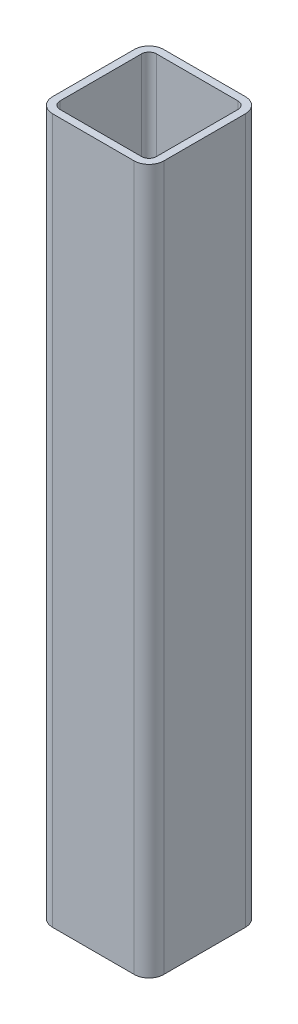
ISO-10303-21;
HEADER;
FILE_DESCRIPTION(('STEP AP214'),'2;1');
FILE_NAME('part.step','',(''),(''),'','','');
FILE_SCHEMA(('AUTOMOTIVE_DESIGN { 1 0 10303 214 1 1 1 1 }'));
ENDSEC;
DATA;
#1=APPLICATION_CONTEXT('core data for automotive mechanical design processes');
#2=APPLICATION_PROTOCOL_DEFINITION('international standard','automotive_design',2000,#1);
#3=PRODUCT_CONTEXT('',#1,'mechanical');
#4=PRODUCT('Part','Part','',(#3));
#5=PRODUCT_RELATED_PRODUCT_CATEGORY('part','',(#4));
#6=PRODUCT_DEFINITION_FORMATION('','',#4);
#7=PRODUCT_DEFINITION_CONTEXT('part definition',#1,'design');
#8=PRODUCT_DEFINITION('design','',#6,#7);
#9=PRODUCT_DEFINITION_SHAPE('','',#8);
#10=(LENGTH_UNIT() NAMED_UNIT(*) SI_UNIT(.MILLI.,.METRE.));
#11=(NAMED_UNIT(*) PLANE_ANGLE_UNIT() SI_UNIT($,.RADIAN.));
#12=(NAMED_UNIT(*) SI_UNIT($,.STERADIAN.) SOLID_ANGLE_UNIT());
#13=UNCERTAINTY_MEASURE_WITH_UNIT(LENGTH_MEASURE(1.E-05),#10,'distance_accuracy_value','');
#14=(GEOMETRIC_REPRESENTATION_CONTEXT(3) GLOBAL_UNCERTAINTY_ASSIGNED_CONTEXT((#13)) GLOBAL_UNIT_ASSIGNED_CONTEXT((#10,
#11,#12)) REPRESENTATION_CONTEXT('',''));
#15=CARTESIAN_POINT('',(0.,0.,0.));
#16=DIRECTION('',(0.,0.,1.));
#17=DIRECTION('',(1.,0.,0.));
#18=AXIS2_PLACEMENT_3D('',#15,#16,#17);
#19=CARTESIAN_POINT('',(4.,95.,-4.));
#20=DIRECTION('',(0.,-1.,0.));
#21=DIRECTION('',(0.,0.,-1.));
#22=AXIS2_PLACEMENT_3D('',#19,#20,#21);
#23=PLANE('',#22);
#24=CARTESIAN_POINT('',(4.,95.,-4.));
#25=DIRECTION('',(0.,1.,0.));
#26=DIRECTION('',(0.,0.,-1.));
#27=AXIS2_PLACEMENT_3D('',#24,#25,#26);
#28=CIRCLE('',#27,4.);
#29=CARTESIAN_POINT('',(0.,95.,-4.00000000000003));
#30=VERTEX_POINT('',#29);
#31=CARTESIAN_POINT('',(4.00000000000003,95.,0.));
#32=VERTEX_POINT('',#31);
#33=EDGE_CURVE('E213',#30,#32,#28,.T.);
#34=ORIENTED_EDGE('',*,*,#33,.T.);
#35=DIRECTION('',(1.,0.,0.));
#36=VECTOR('',#35,1.);
#37=CARTESIAN_POINT('',(4.00000000000003,95.,0.));
#38=LINE('',#37,#36);
#39=CARTESIAN_POINT('',(26.,95.,0.));
#40=VERTEX_POINT('',#39);
#41=EDGE_CURVE('E216',#32,#40,#38,.T.);
#42=ORIENTED_EDGE('',*,*,#41,.T.);
#43=CARTESIAN_POINT('',(26.,95.,-4.));
#44=DIRECTION('',(0.,1.,0.));
#45=DIRECTION('',(0.,0.,1.));
#46=AXIS2_PLACEMENT_3D('',#43,#44,#45);
#47=CIRCLE('',#46,4.);
#48=CARTESIAN_POINT('',(30.,95.,-4.00000000000003));
#49=VERTEX_POINT('',#48);
#50=EDGE_CURVE('E219',#40,#49,#47,.T.);
#51=ORIENTED_EDGE('',*,*,#50,.T.);
#52=DIRECTION('',(0.,0.,-1.));
#53=VECTOR('',#52,1.);
#54=CARTESIAN_POINT('',(30.,95.,-4.00000000000003));
#55=LINE('',#54,#53);
#56=CARTESIAN_POINT('',(30.,95.,-26.));
#57=VERTEX_POINT('',#56);
#58=EDGE_CURVE('E221',#49,#57,#55,.T.);
#59=ORIENTED_EDGE('',*,*,#58,.T.);
#60=CARTESIAN_POINT('',(26.,95.,-26.));
#61=DIRECTION('',(0.,1.,0.));
#62=DIRECTION('',(0.,0.,-1.));
#63=AXIS2_PLACEMENT_3D('',#60,#61,#62);
#64=CIRCLE('',#63,4.);
#65=CARTESIAN_POINT('',(26.,95.,-30.));
#66=VERTEX_POINT('',#65);
#67=EDGE_CURVE('E223',#57,#66,#64,.T.);
#68=ORIENTED_EDGE('',*,*,#67,.T.);
#69=DIRECTION('',(-1.,0.,0.));
#70=VECTOR('',#69,1.);
#71=CARTESIAN_POINT('',(4.00000000000003,95.,-30.));
#72=LINE('',#71,#70);
#73=CARTESIAN_POINT('',(4.00000000000003,95.,-30.));
#74=VERTEX_POINT('',#73);
#75=EDGE_CURVE('E225',#66,#74,#72,.T.);
#76=ORIENTED_EDGE('',*,*,#75,.T.);
#77=CARTESIAN_POINT('',(4.,95.,-26.));
#78=DIRECTION('',(0.,1.,0.));
#79=DIRECTION('',(0.,0.,-1.));
#80=AXIS2_PLACEMENT_3D('',#77,#78,#79);
#81=CIRCLE('',#80,4.);
#82=CARTESIAN_POINT('',(0.,95.,-26.));
#83=VERTEX_POINT('',#82);
#84=EDGE_CURVE('E227',#74,#83,#81,.T.);
#85=ORIENTED_EDGE('',*,*,#84,.T.);
#86=DIRECTION('',(0.,0.,1.));
#87=VECTOR('',#86,1.);
#88=CARTESIAN_POINT('',(0.,95.,-4.00000000000003));
#89=LINE('',#88,#87);
#90=EDGE_CURVE('E229',#83,#30,#89,.T.);
#91=ORIENTED_EDGE('',*,*,#90,.T.);
#92=EDGE_LOOP('',(#34,#42,#51,#59,#68,#76,#85,#91));
#93=FACE_BOUND('',#92,.T.);
#94=CARTESIAN_POINT('',(4.,95.,-4.));
#95=DIRECTION('',(0.,1.,0.));
#96=DIRECTION('',(0.,0.,-1.));
#97=AXIS2_PLACEMENT_3D('',#94,#95,#96);
#98=CIRCLE('',#97,2.);
#99=CARTESIAN_POINT('',(2.,95.,-4.00000000000003));
#100=VERTEX_POINT('',#99);
#101=CARTESIAN_POINT('',(4.00000000000003,95.,-2.));
#102=VERTEX_POINT('',#101);
#103=EDGE_CURVE('E148',#100,#102,#98,.T.);
#104=ORIENTED_EDGE('',*,*,#103,.F.);
#105=DIRECTION('',(0.,0.,1.));
#106=VECTOR('',#105,1.);
#107=CARTESIAN_POINT('',(2.,95.,-4.00000000000003));
#108=LINE('',#107,#106);
#109=CARTESIAN_POINT('',(2.,95.,-26.));
#110=VERTEX_POINT('',#109);
#111=EDGE_CURVE('E181',#110,#100,#108,.T.);
#112=ORIENTED_EDGE('',*,*,#111,.F.);
#113=CARTESIAN_POINT('',(4.,95.,-26.));
#114=DIRECTION('',(0.,1.,0.));
#115=DIRECTION('',(0.,0.,-1.));
#116=AXIS2_PLACEMENT_3D('',#113,#114,#115);
#117=CIRCLE('',#116,2.);
#118=CARTESIAN_POINT('',(4.00000000000003,95.,-28.));
#119=VERTEX_POINT('',#118);
#120=EDGE_CURVE('E179',#119,#110,#117,.T.);
#121=ORIENTED_EDGE('',*,*,#120,.F.);
#122=DIRECTION('',(-1.,0.,0.));
#123=VECTOR('',#122,1.);
#124=CARTESIAN_POINT('',(4.00000000000003,95.,-28.));
#125=LINE('',#124,#123);
#126=CARTESIAN_POINT('',(26.,95.,-28.));
#127=VERTEX_POINT('',#126);
#128=EDGE_CURVE('E177',#127,#119,#125,.T.);
#129=ORIENTED_EDGE('',*,*,#128,.F.);
#130=CARTESIAN_POINT('',(26.,95.,-26.));
#131=DIRECTION('',(0.,1.,0.));
#132=DIRECTION('',(0.,0.,-1.));
#133=AXIS2_PLACEMENT_3D('',#130,#131,#132);
#134=CIRCLE('',#133,2.);
#135=CARTESIAN_POINT('',(28.,95.,-26.));
#136=VERTEX_POINT('',#135);
#137=EDGE_CURVE('E175',#136,#127,#134,.T.);
#138=ORIENTED_EDGE('',*,*,#137,.F.);
#139=DIRECTION('',(0.,0.,-1.));
#140=VECTOR('',#139,1.);
#141=CARTESIAN_POINT('',(28.,95.,-4.00000000000001));
#142=LINE('',#141,#140);
#143=CARTESIAN_POINT('',(28.,95.,-4.00000000000001));
#144=VERTEX_POINT('',#143);
#145=EDGE_CURVE('E171',#144,#136,#142,.T.);
#146=ORIENTED_EDGE('',*,*,#145,.F.);
#147=CARTESIAN_POINT('',(26.,95.,-4.));
#148=DIRECTION('',(0.,1.,0.));
#149=DIRECTION('',(0.,0.,1.));
#150=AXIS2_PLACEMENT_3D('',#147,#148,#149);
#151=CIRCLE('',#150,2.);
#152=CARTESIAN_POINT('',(26.,95.,-2.));
#153=VERTEX_POINT('',#152);
#154=EDGE_CURVE('E169',#153,#144,#151,.T.);
#155=ORIENTED_EDGE('',*,*,#154,.F.);
#156=DIRECTION('',(1.,0.,0.));
#157=VECTOR('',#156,1.);
#158=CARTESIAN_POINT('',(4.00000000000003,95.,-2.));
#159=LINE('',#158,#157);
#160=EDGE_CURVE('E156',#102,#153,#159,.T.);
#161=ORIENTED_EDGE('',*,*,#160,.F.);
#162=EDGE_LOOP('',(#104,#112,#121,#129,#138,#146,#155,#161));
#163=FACE_BOUND('',#162,.T.);
#164=ADVANCED_FACE('F35',(#93,#163),#23,.F.);
#165=CARTESIAN_POINT('',(4.,-95.,-4.));
#166=DIRECTION('',(0.,-1.,0.));
#167=DIRECTION('',(0.,0.,-1.));
#168=AXIS2_PLACEMENT_3D('',#165,#166,#167);
#169=PLANE('',#168);
#170=CARTESIAN_POINT('',(4.,-95.,-4.));
#171=DIRECTION('',(0.,1.,0.));
#172=DIRECTION('',(0.,0.,-1.));
#173=AXIS2_PLACEMENT_3D('',#170,#171,#172);
#174=CIRCLE('',#173,4.);
#175=CARTESIAN_POINT('',(0.,-95.,-4.00000000000003));
#176=VERTEX_POINT('',#175);
#177=CARTESIAN_POINT('',(4.00000000000003,-95.,0.));
#178=VERTEX_POINT('',#177);
#179=EDGE_CURVE('E164',#176,#178,#174,.T.);
#180=ORIENTED_EDGE('',*,*,#179,.F.);
#181=DIRECTION('',(0.,0.,1.));
#182=VECTOR('',#181,1.);
#183=CARTESIAN_POINT('',(0.,-95.,-4.00000000000003));
#184=LINE('',#183,#182);
#185=CARTESIAN_POINT('',(0.,-95.,-26.));
#186=VERTEX_POINT('',#185);
#187=EDGE_CURVE('E217',#186,#176,#184,.T.);
#188=ORIENTED_EDGE('',*,*,#187,.F.);
#189=CARTESIAN_POINT('',(4.,-95.,-26.));
#190=DIRECTION('',(0.,1.,0.));
#191=DIRECTION('',(0.,0.,-1.));
#192=AXIS2_PLACEMENT_3D('',#189,#190,#191);
#193=CIRCLE('',#192,4.);
#194=CARTESIAN_POINT('',(4.00000000000003,-95.,-30.));
#195=VERTEX_POINT('',#194);
#196=EDGE_CURVE('E244',#195,#186,#193,.T.);
#197=ORIENTED_EDGE('',*,*,#196,.F.);
#198=DIRECTION('',(-1.,0.,0.));
#199=VECTOR('',#198,1.);
#200=CARTESIAN_POINT('',(4.00000000000003,-95.,-30.));
#201=LINE('',#200,#199);
#202=CARTESIAN_POINT('',(26.,-95.,-30.));
#203=VERTEX_POINT('',#202);
#204=EDGE_CURVE('E242',#203,#195,#201,.T.);
#205=ORIENTED_EDGE('',*,*,#204,.F.);
#206=CARTESIAN_POINT('',(26.,-95.,-26.));
#207=DIRECTION('',(0.,1.,0.));
#208=DIRECTION('',(0.,0.,-1.));
#209=AXIS2_PLACEMENT_3D('',#206,#207,#208);
#210=CIRCLE('',#209,4.);
#211=CARTESIAN_POINT('',(30.,-95.,-26.));
#212=VERTEX_POINT('',#211);
#213=EDGE_CURVE('E240',#212,#203,#210,.T.);
#214=ORIENTED_EDGE('',*,*,#213,.F.);
#215=DIRECTION('',(0.,0.,-1.));
#216=VECTOR('',#215,1.);
#217=CARTESIAN_POINT('',(30.,-95.,-4.00000000000003));
#218=LINE('',#217,#216);
#219=CARTESIAN_POINT('',(30.,-95.,-4.00000000000003));
#220=VERTEX_POINT('',#219);
#221=EDGE_CURVE('E238',#220,#212,#218,.T.);
#222=ORIENTED_EDGE('',*,*,#221,.F.);
#223=CARTESIAN_POINT('',(26.,-95.,-4.));
#224=DIRECTION('',(0.,1.,0.));
#225=DIRECTION('',(0.,0.,1.));
#226=AXIS2_PLACEMENT_3D('',#223,#224,#225);
#227=CIRCLE('',#226,4.);
#228=CARTESIAN_POINT('',(26.,-95.,0.));
#229=VERTEX_POINT('',#228);
#230=EDGE_CURVE('E236',#229,#220,#227,.T.);
#231=ORIENTED_EDGE('',*,*,#230,.F.);
#232=DIRECTION('',(1.,0.,0.));
#233=VECTOR('',#232,1.);
#234=CARTESIAN_POINT('',(4.00000000000003,-95.,0.));
#235=LINE('',#234,#233);
#236=EDGE_CURVE('E234',#178,#229,#235,.T.);
#237=ORIENTED_EDGE('',*,*,#236,.F.);
#238=EDGE_LOOP('',(#180,#188,#197,#205,#214,#222,#231,#237));
#239=FACE_BOUND('',#238,.T.);
#240=DIRECTION('',(0.,0.,1.));
#241=VECTOR('',#240,1.);
#242=CARTESIAN_POINT('',(2.,-95.,-4.00000000000003));
#243=LINE('',#242,#241);
#244=CARTESIAN_POINT('',(2.,-95.,-26.));
#245=VERTEX_POINT('',#244);
#246=CARTESIAN_POINT('',(2.,-95.,-4.00000000000003));
#247=VERTEX_POINT('',#246);
#248=EDGE_CURVE('E157',#245,#247,#243,.T.);
#249=ORIENTED_EDGE('',*,*,#248,.T.);
#250=CARTESIAN_POINT('',(4.,-95.,-4.));
#251=DIRECTION('',(0.,1.,0.));
#252=DIRECTION('',(0.,0.,-1.));
#253=AXIS2_PLACEMENT_3D('',#250,#251,#252);
#254=CIRCLE('',#253,2.);
#255=CARTESIAN_POINT('',(4.00000000000003,-95.,-2.));
#256=VERTEX_POINT('',#255);
#257=EDGE_CURVE('E58',#247,#256,#254,.T.);
#258=ORIENTED_EDGE('',*,*,#257,.T.);
#259=DIRECTION('',(1.,0.,0.));
#260=VECTOR('',#259,1.);
#261=CARTESIAN_POINT('',(4.00000000000003,-95.,-2.));
#262=LINE('',#261,#260);
#263=CARTESIAN_POINT('',(26.,-95.,-2.));
#264=VERTEX_POINT('',#263);
#265=EDGE_CURVE('E163',#256,#264,#262,.T.);
#266=ORIENTED_EDGE('',*,*,#265,.T.);
#267=CARTESIAN_POINT('',(26.,-95.,-4.));
#268=DIRECTION('',(0.,1.,0.));
#269=DIRECTION('',(0.,0.,1.));
#270=AXIS2_PLACEMENT_3D('',#267,#268,#269);
#271=CIRCLE('',#270,2.);
#272=CARTESIAN_POINT('',(28.,-95.,-4.00000000000001));
#273=VERTEX_POINT('',#272);
#274=EDGE_CURVE('E185',#264,#273,#271,.T.);
#275=ORIENTED_EDGE('',*,*,#274,.T.);
#276=DIRECTION('',(0.,0.,-1.));
#277=VECTOR('',#276,1.);
#278=CARTESIAN_POINT('',(28.,-95.,-4.00000000000001));
#279=LINE('',#278,#277);
#280=CARTESIAN_POINT('',(28.,-95.,-26.));
#281=VERTEX_POINT('',#280);
#282=EDGE_CURVE('E188',#273,#281,#279,.T.);
#283=ORIENTED_EDGE('',*,*,#282,.T.);
#284=CARTESIAN_POINT('',(26.,-95.,-26.));
#285=DIRECTION('',(0.,1.,0.));
#286=DIRECTION('',(0.,0.,-1.));
#287=AXIS2_PLACEMENT_3D('',#284,#285,#286);
#288=CIRCLE('',#287,2.);
#289=CARTESIAN_POINT('',(26.,-95.,-28.));
#290=VERTEX_POINT('',#289);
#291=EDGE_CURVE('E191',#281,#290,#288,.T.);
#292=ORIENTED_EDGE('',*,*,#291,.T.);
#293=DIRECTION('',(-1.,0.,0.));
#294=VECTOR('',#293,1.);
#295=CARTESIAN_POINT('',(4.00000000000003,-95.,-28.));
#296=LINE('',#295,#294);
#297=CARTESIAN_POINT('',(4.00000000000003,-95.,-28.));
#298=VERTEX_POINT('',#297);
#299=EDGE_CURVE('E194',#290,#298,#296,.T.);
#300=ORIENTED_EDGE('',*,*,#299,.T.);
#301=CARTESIAN_POINT('',(4.,-95.,-26.));
#302=DIRECTION('',(0.,1.,0.));
#303=DIRECTION('',(0.,0.,-1.));
#304=AXIS2_PLACEMENT_3D('',#301,#302,#303);
#305=CIRCLE('',#304,2.);
#306=EDGE_CURVE('E197',#298,#245,#305,.T.);
#307=ORIENTED_EDGE('',*,*,#306,.T.);
#308=EDGE_LOOP('',(#249,#258,#266,#275,#283,#292,#300,#307));
#309=FACE_BOUND('',#308,.T.);
#310=ADVANCED_FACE('F274',(#239,#309),#169,.T.);
#311=CARTESIAN_POINT('',(4.,95.,-4.));
#312=DIRECTION('',(0.,-1.,0.));
#313=DIRECTION('',(0.,0.,-1.));
#314=AXIS2_PLACEMENT_3D('',#311,#312,#313);
#315=CYLINDRICAL_SURFACE('',#314,4.);
#316=ORIENTED_EDGE('',*,*,#179,.T.);
#317=DIRECTION('',(0.,-1.,0.));
#318=VECTOR('',#317,1.);
#319=CARTESIAN_POINT('',(4.00000000000003,95.,0.));
#320=LINE('',#319,#318);
#321=EDGE_CURVE('E11',#32,#178,#320,.T.);
#322=ORIENTED_EDGE('',*,*,#321,.F.);
#323=ORIENTED_EDGE('',*,*,#33,.F.);
#324=DIRECTION('',(0.,-1.,0.));
#325=VECTOR('',#324,1.);
#326=CARTESIAN_POINT('',(0.,95.,-4.00000000000003));
#327=LINE('',#326,#325);
#328=EDGE_CURVE('E231',#30,#176,#327,.T.);
#329=ORIENTED_EDGE('',*,*,#328,.T.);
#330=EDGE_LOOP('',(#316,#322,#323,#329));
#331=FACE_BOUND('',#330,.T.);
#332=ADVANCED_FACE('F37',(#331),#315,.T.);
#333=CARTESIAN_POINT('',(4.00000000000003,95.,0.));
#334=DIRECTION('',(0.,0.,-1.));
#335=DIRECTION('',(-1.,0.,0.));
#336=AXIS2_PLACEMENT_3D('',#333,#334,#335);
#337=PLANE('',#336);
#338=ORIENTED_EDGE('',*,*,#236,.T.);
#339=DIRECTION('',(0.,-1.,0.));
#340=VECTOR('',#339,1.);
#341=CARTESIAN_POINT('',(26.,95.,0.));
#342=LINE('',#341,#340);
#343=EDGE_CURVE('E43',#40,#229,#342,.T.);
#344=ORIENTED_EDGE('',*,*,#343,.F.);
#345=ORIENTED_EDGE('',*,*,#41,.F.);
#346=ORIENTED_EDGE('',*,*,#321,.T.);
#347=EDGE_LOOP('',(#338,#344,#345,#346));
#348=FACE_BOUND('',#347,.T.);
#349=ADVANCED_FACE('F291',(#348),#337,.F.);
#350=CARTESIAN_POINT('',(26.,95.,-4.));
#351=DIRECTION('',(0.,-1.,0.));
#352=DIRECTION('',(0.,0.,-1.));
#353=AXIS2_PLACEMENT_3D('',#350,#351,#352);
#354=CYLINDRICAL_SURFACE('',#353,4.);
#355=ORIENTED_EDGE('',*,*,#230,.T.);
#356=DIRECTION('',(0.,-1.,0.));
#357=VECTOR('',#356,1.);
#358=CARTESIAN_POINT('',(30.,95.,-4.00000000000003));
#359=LINE('',#358,#357);
#360=EDGE_CURVE('E261',#49,#220,#359,.T.);
#361=ORIENTED_EDGE('',*,*,#360,.F.);
#362=ORIENTED_EDGE('',*,*,#50,.F.);
#363=ORIENTED_EDGE('',*,*,#343,.T.);
#364=EDGE_LOOP('',(#355,#361,#362,#363));
#365=FACE_BOUND('',#364,.T.);
#366=ADVANCED_FACE('F268',(#365),#354,.T.);
#367=CARTESIAN_POINT('',(30.,95.,-4.00000000000003));
#368=DIRECTION('',(-1.,0.,0.));
#369=DIRECTION('',(0.,0.,1.));
#370=AXIS2_PLACEMENT_3D('',#367,#368,#369);
#371=PLANE('',#370);
#372=ORIENTED_EDGE('',*,*,#221,.T.);
#373=DIRECTION('',(0.,-1.,0.));
#374=VECTOR('',#373,1.);
#375=CARTESIAN_POINT('',(30.,95.,-26.));
#376=LINE('',#375,#374);
#377=EDGE_CURVE('E258',#57,#212,#376,.T.);
#378=ORIENTED_EDGE('',*,*,#377,.F.);
#379=ORIENTED_EDGE('',*,*,#58,.F.);
#380=ORIENTED_EDGE('',*,*,#360,.T.);
#381=EDGE_LOOP('',(#372,#378,#379,#380));
#382=FACE_BOUND('',#381,.T.);
#383=ADVANCED_FACE('F280',(#382),#371,.F.);
#384=CARTESIAN_POINT('',(26.,95.,-26.));
#385=DIRECTION('',(0.,-1.,0.));
#386=DIRECTION('',(0.,0.,-1.));
#387=AXIS2_PLACEMENT_3D('',#384,#385,#386);
#388=CYLINDRICAL_SURFACE('',#387,4.);
#389=ORIENTED_EDGE('',*,*,#213,.T.);
#390=DIRECTION('',(0.,-1.,0.));
#391=VECTOR('',#390,1.);
#392=CARTESIAN_POINT('',(26.,95.,-30.));
#393=LINE('',#392,#391);
#394=EDGE_CURVE('E255',#66,#203,#393,.T.);
#395=ORIENTED_EDGE('',*,*,#394,.F.);
#396=ORIENTED_EDGE('',*,*,#67,.F.);
#397=ORIENTED_EDGE('',*,*,#377,.T.);
#398=EDGE_LOOP('',(#389,#395,#396,#397));
#399=FACE_BOUND('',#398,.T.);
#400=ADVANCED_FACE('F284',(#399),#388,.T.);
#401=CARTESIAN_POINT('',(4.00000000000003,95.,-30.));
#402=DIRECTION('',(0.,0.,1.));
#403=DIRECTION('',(1.,0.,0.));
#404=AXIS2_PLACEMENT_3D('',#401,#402,#403);
#405=PLANE('',#404);
#406=ORIENTED_EDGE('',*,*,#204,.T.);
#407=DIRECTION('',(0.,-1.,0.));
#408=VECTOR('',#407,1.);
#409=CARTESIAN_POINT('',(4.00000000000003,95.,-30.));
#410=LINE('',#409,#408);
#411=EDGE_CURVE('E252',#74,#195,#410,.T.);
#412=ORIENTED_EDGE('',*,*,#411,.F.);
#413=ORIENTED_EDGE('',*,*,#75,.F.);
#414=ORIENTED_EDGE('',*,*,#394,.T.);
#415=EDGE_LOOP('',(#406,#412,#413,#414));
#416=FACE_BOUND('',#415,.T.);
#417=ADVANCED_FACE('F304',(#416),#405,.F.);
#418=CARTESIAN_POINT('',(4.,95.,-26.));
#419=DIRECTION('',(0.,-1.,0.));
#420=DIRECTION('',(0.,0.,-1.));
#421=AXIS2_PLACEMENT_3D('',#418,#419,#420);
#422=CYLINDRICAL_SURFACE('',#421,4.);
#423=ORIENTED_EDGE('',*,*,#196,.T.);
#424=DIRECTION('',(0.,-1.,0.));
#425=VECTOR('',#424,1.);
#426=CARTESIAN_POINT('',(0.,95.,-26.));
#427=LINE('',#426,#425);
#428=EDGE_CURVE('E249',#83,#186,#427,.T.);
#429=ORIENTED_EDGE('',*,*,#428,.F.);
#430=ORIENTED_EDGE('',*,*,#84,.F.);
#431=ORIENTED_EDGE('',*,*,#411,.T.);
#432=EDGE_LOOP('',(#423,#429,#430,#431));
#433=FACE_BOUND('',#432,.T.);
#434=ADVANCED_FACE('F302',(#433),#422,.T.);
#435=CARTESIAN_POINT('',(0.,95.,-4.00000000000003));
#436=DIRECTION('',(1.,0.,0.));
#437=DIRECTION('',(0.,0.,-1.));
#438=AXIS2_PLACEMENT_3D('',#435,#436,#437);
#439=PLANE('',#438);
#440=ORIENTED_EDGE('',*,*,#187,.T.);
#441=ORIENTED_EDGE('',*,*,#328,.F.);
#442=ORIENTED_EDGE('',*,*,#90,.F.);
#443=ORIENTED_EDGE('',*,*,#428,.T.);
#444=EDGE_LOOP('',(#440,#441,#442,#443));
#445=FACE_BOUND('',#444,.T.);
#446=ADVANCED_FACE('F297',(#445),#439,.F.);
#447=CARTESIAN_POINT('',(4.,95.,-4.));
#448=DIRECTION('',(0.,-1.,0.));
#449=DIRECTION('',(0.,0.,-1.));
#450=AXIS2_PLACEMENT_3D('',#447,#448,#449);
#451=CYLINDRICAL_SURFACE('',#450,2.);
#452=ORIENTED_EDGE('',*,*,#257,.F.);
#453=DIRECTION('',(0.,-1.,0.));
#454=VECTOR('',#453,1.);
#455=CARTESIAN_POINT('',(2.,95.,-4.00000000000003));
#456=LINE('',#455,#454);
#457=EDGE_CURVE('E152',#100,#247,#456,.T.);
#458=ORIENTED_EDGE('',*,*,#457,.F.);
#459=ORIENTED_EDGE('',*,*,#103,.T.);
#460=DIRECTION('',(0.,-1.,0.));
#461=VECTOR('',#460,1.);
#462=CARTESIAN_POINT('',(4.00000000000003,95.,-2.));
#463=LINE('',#462,#461);
#464=EDGE_CURVE('E151',#102,#256,#463,.T.);
#465=ORIENTED_EDGE('',*,*,#464,.T.);
#466=EDGE_LOOP('',(#452,#458,#459,#465));
#467=FACE_BOUND('',#466,.T.);
#468=ADVANCED_FACE('F150',(#467),#451,.F.);
#469=CARTESIAN_POINT('',(4.00000000000003,95.,-2.));
#470=DIRECTION('',(0.,0.,-1.));
#471=DIRECTION('',(-1.,0.,0.));
#472=AXIS2_PLACEMENT_3D('',#469,#470,#471);
#473=PLANE('',#472);
#474=ORIENTED_EDGE('',*,*,#265,.F.);
#475=ORIENTED_EDGE('',*,*,#464,.F.);
#476=ORIENTED_EDGE('',*,*,#160,.T.);
#477=DIRECTION('',(0.,-1.,0.));
#478=VECTOR('',#477,1.);
#479=CARTESIAN_POINT('',(26.,95.,-2.));
#480=LINE('',#479,#478);
#481=EDGE_CURVE('E165',#153,#264,#480,.T.);
#482=ORIENTED_EDGE('',*,*,#481,.T.);
#483=EDGE_LOOP('',(#474,#475,#476,#482));
#484=FACE_BOUND('',#483,.T.);
#485=ADVANCED_FACE('F160',(#484),#473,.T.);
#486=CARTESIAN_POINT('',(26.,95.,-4.));
#487=DIRECTION('',(0.,-1.,0.));
#488=DIRECTION('',(0.,0.,-1.));
#489=AXIS2_PLACEMENT_3D('',#486,#487,#488);
#490=CYLINDRICAL_SURFACE('',#489,2.);
#491=ORIENTED_EDGE('',*,*,#274,.F.);
#492=ORIENTED_EDGE('',*,*,#481,.F.);
#493=ORIENTED_EDGE('',*,*,#154,.T.);
#494=DIRECTION('',(0.,-1.,0.));
#495=VECTOR('',#494,1.);
#496=CARTESIAN_POINT('',(28.,95.,-4.00000000000001));
#497=LINE('',#496,#495);
#498=EDGE_CURVE('E210',#144,#273,#497,.T.);
#499=ORIENTED_EDGE('',*,*,#498,.T.);
#500=EDGE_LOOP('',(#491,#492,#493,#499));
#501=FACE_BOUND('',#500,.T.);
#502=ADVANCED_FACE('F329',(#501),#490,.F.);
#503=CARTESIAN_POINT('',(28.,95.,-4.00000000000001));
#504=DIRECTION('',(-1.,0.,0.));
#505=DIRECTION('',(0.,0.,1.));
#506=AXIS2_PLACEMENT_3D('',#503,#504,#505);
#507=PLANE('',#506);
#508=ORIENTED_EDGE('',*,*,#282,.F.);
#509=ORIENTED_EDGE('',*,*,#498,.F.);
#510=ORIENTED_EDGE('',*,*,#145,.T.);
#511=DIRECTION('',(0.,-1.,0.));
#512=VECTOR('',#511,1.);
#513=CARTESIAN_POINT('',(28.,95.,-26.));
#514=LINE('',#513,#512);
#515=EDGE_CURVE('E208',#136,#281,#514,.T.);
#516=ORIENTED_EDGE('',*,*,#515,.T.);
#517=EDGE_LOOP('',(#508,#509,#510,#516));
#518=FACE_BOUND('',#517,.T.);
#519=ADVANCED_FACE('F333',(#518),#507,.T.);
#520=CARTESIAN_POINT('',(26.,95.,-26.));
#521=DIRECTION('',(0.,-1.,0.));
#522=DIRECTION('',(0.,0.,-1.));
#523=AXIS2_PLACEMENT_3D('',#520,#521,#522);
#524=CYLINDRICAL_SURFACE('',#523,2.);
#525=ORIENTED_EDGE('',*,*,#291,.F.);
#526=ORIENTED_EDGE('',*,*,#515,.F.);
#527=ORIENTED_EDGE('',*,*,#137,.T.);
#528=DIRECTION('',(0.,-1.,0.));
#529=VECTOR('',#528,1.);
#530=CARTESIAN_POINT('',(26.,95.,-28.));
#531=LINE('',#530,#529);
#532=EDGE_CURVE('E206',#127,#290,#531,.T.);
#533=ORIENTED_EDGE('',*,*,#532,.T.);
#534=EDGE_LOOP('',(#525,#526,#527,#533));
#535=FACE_BOUND('',#534,.T.);
#536=ADVANCED_FACE('F339',(#535),#524,.F.);
#537=CARTESIAN_POINT('',(4.00000000000003,95.,-28.));
#538=DIRECTION('',(0.,0.,1.));
#539=DIRECTION('',(1.,0.,0.));
#540=AXIS2_PLACEMENT_3D('',#537,#538,#539);
#541=PLANE('',#540);
#542=ORIENTED_EDGE('',*,*,#299,.F.);
#543=ORIENTED_EDGE('',*,*,#532,.F.);
#544=ORIENTED_EDGE('',*,*,#128,.T.);
#545=DIRECTION('',(0.,-1.,0.));
#546=VECTOR('',#545,1.);
#547=CARTESIAN_POINT('',(4.00000000000003,95.,-28.));
#548=LINE('',#547,#546);
#549=EDGE_CURVE('E204',#119,#298,#548,.T.);
#550=ORIENTED_EDGE('',*,*,#549,.T.);
#551=EDGE_LOOP('',(#542,#543,#544,#550));
#552=FACE_BOUND('',#551,.T.);
#553=ADVANCED_FACE('F343',(#552),#541,.T.);
#554=CARTESIAN_POINT('',(4.,95.,-26.));
#555=DIRECTION('',(0.,-1.,0.));
#556=DIRECTION('',(0.,0.,-1.));
#557=AXIS2_PLACEMENT_3D('',#554,#555,#556);
#558=CYLINDRICAL_SURFACE('',#557,2.);
#559=ORIENTED_EDGE('',*,*,#306,.F.);
#560=ORIENTED_EDGE('',*,*,#549,.F.);
#561=ORIENTED_EDGE('',*,*,#120,.T.);
#562=DIRECTION('',(0.,-1.,0.));
#563=VECTOR('',#562,1.);
#564=CARTESIAN_POINT('',(2.,95.,-26.));
#565=LINE('',#564,#563);
#566=EDGE_CURVE('E50',#110,#245,#565,.T.);
#567=ORIENTED_EDGE('',*,*,#566,.T.);
#568=EDGE_LOOP('',(#559,#560,#561,#567));
#569=FACE_BOUND('',#568,.T.);
#570=ADVANCED_FACE('F347',(#569),#558,.F.);
#571=CARTESIAN_POINT('',(2.,95.,-4.00000000000003));
#572=DIRECTION('',(1.,0.,0.));
#573=DIRECTION('',(0.,0.,-1.));
#574=AXIS2_PLACEMENT_3D('',#571,#572,#573);
#575=PLANE('',#574);
#576=ORIENTED_EDGE('',*,*,#248,.F.);
#577=ORIENTED_EDGE('',*,*,#566,.F.);
#578=ORIENTED_EDGE('',*,*,#111,.T.);
#579=ORIENTED_EDGE('',*,*,#457,.T.);
#580=EDGE_LOOP('',(#576,#577,#578,#579));
#581=FACE_BOUND('',#580,.T.);
#582=ADVANCED_FACE('F351',(#581),#575,.T.);
#583=CLOSED_SHELL('',(#164,#310,#332,#349,#366,#383,#400,#417,#434,#446,#468,#485,#502,#519,
#536,#553,#570,#582));
#584=MANIFOLD_SOLID_BREP('B2',#583);
#585=ADVANCED_BREP_SHAPE_REPRESENTATION('',(#18,#584),#14);
#586=SHAPE_DEFINITION_REPRESENTATION(#9,#585);
ENDSEC;
END-ISO-10303-21;
